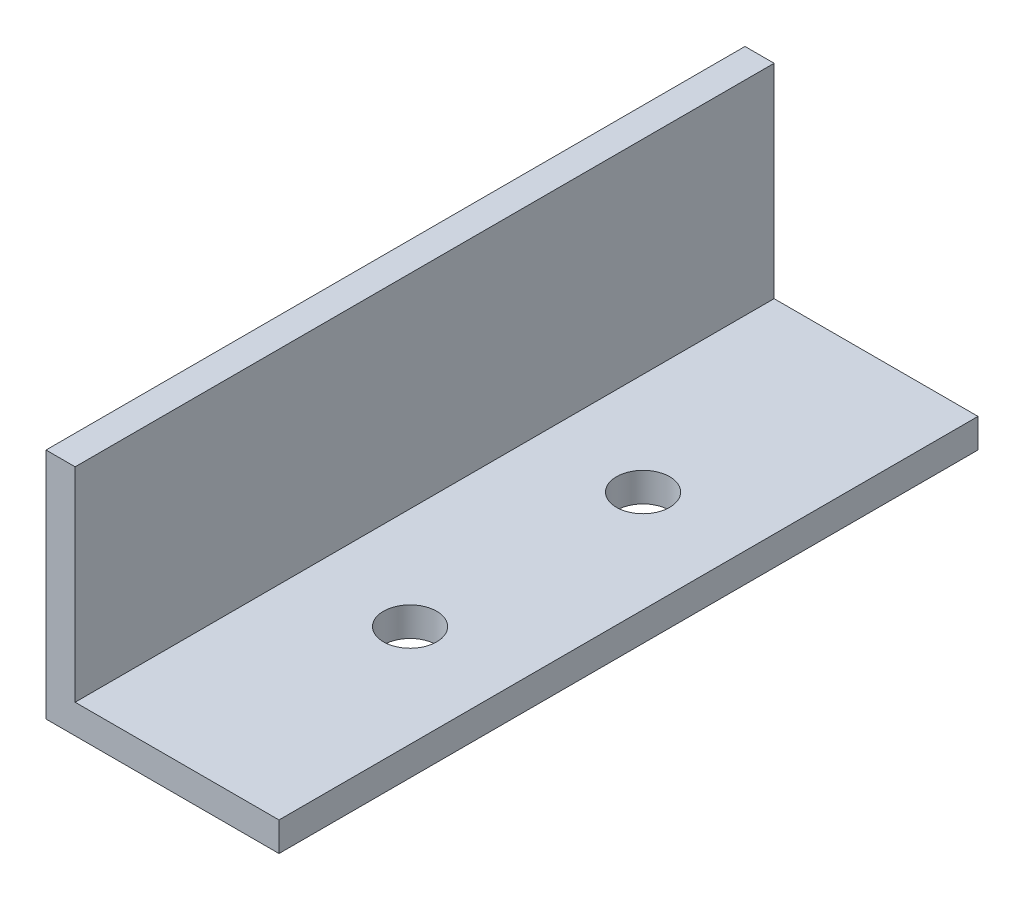
ISO-10303-21;
HEADER;
FILE_DESCRIPTION(('STEP AP214'),'2;1');
FILE_NAME('part.step','',(''),(''),'','','');
FILE_SCHEMA(('AUTOMOTIVE_DESIGN { 1 0 10303 214 1 1 1 1 }'));
ENDSEC;
DATA;
#1=APPLICATION_CONTEXT('core data for automotive mechanical design processes');
#2=APPLICATION_PROTOCOL_DEFINITION('international standard','automotive_design',2000,#1);
#3=PRODUCT_CONTEXT('',#1,'mechanical');
#4=PRODUCT('Part','Part','',(#3));
#5=PRODUCT_RELATED_PRODUCT_CATEGORY('part','',(#4));
#6=PRODUCT_DEFINITION_FORMATION('','',#4);
#7=PRODUCT_DEFINITION_CONTEXT('part definition',#1,'design');
#8=PRODUCT_DEFINITION('design','',#6,#7);
#9=PRODUCT_DEFINITION_SHAPE('','',#8);
#10=(LENGTH_UNIT() NAMED_UNIT(*) SI_UNIT(.MILLI.,.METRE.));
#11=(NAMED_UNIT(*) PLANE_ANGLE_UNIT() SI_UNIT($,.RADIAN.));
#12=(NAMED_UNIT(*) SI_UNIT($,.STERADIAN.) SOLID_ANGLE_UNIT());
#13=UNCERTAINTY_MEASURE_WITH_UNIT(LENGTH_MEASURE(1.E-05),#10,'distance_accuracy_value','');
#14=(GEOMETRIC_REPRESENTATION_CONTEXT(3) GLOBAL_UNCERTAINTY_ASSIGNED_CONTEXT((#13)) GLOBAL_UNIT_ASSIGNED_CONTEXT((#10,
#11,#12)) REPRESENTATION_CONTEXT('',''));
#15=CARTESIAN_POINT('',(0.,0.,0.));
#16=DIRECTION('',(0.,0.,1.));
#17=DIRECTION('',(1.,0.,0.));
#18=AXIS2_PLACEMENT_3D('',#15,#16,#17);
#19=CARTESIAN_POINT('',(0.,0.,76.2));
#20=DIRECTION('',(1.,0.,0.));
#21=DIRECTION('',(0.,0.,-1.));
#22=AXIS2_PLACEMENT_3D('',#19,#20,#21);
#23=PLANE('',#22);
#24=DIRECTION('',(0.,-1.,0.));
#25=VECTOR('',#24,1.);
#26=CARTESIAN_POINT('',(0.,0.,0.));
#27=LINE('',#26,#25);
#28=CARTESIAN_POINT('',(0.,25.4,0.));
#29=VERTEX_POINT('',#28);
#30=CARTESIAN_POINT('',(0.,0.,0.));
#31=VERTEX_POINT('',#30);
#32=EDGE_CURVE('E130',#29,#31,#27,.T.);
#33=ORIENTED_EDGE('',*,*,#32,.T.);
#34=DIRECTION('',(0.,0.,-1.));
#35=VECTOR('',#34,1.);
#36=CARTESIAN_POINT('',(0.,0.,76.2));
#37=LINE('',#36,#35);
#38=CARTESIAN_POINT('',(0.,0.,76.2));
#39=VERTEX_POINT('',#38);
#40=EDGE_CURVE('E11',#39,#31,#37,.T.);
#41=ORIENTED_EDGE('',*,*,#40,.F.);
#42=DIRECTION('',(0.,-1.,0.));
#43=VECTOR('',#42,1.);
#44=CARTESIAN_POINT('',(0.,0.,76.2));
#45=LINE('',#44,#43);
#46=CARTESIAN_POINT('',(0.,25.4,76.2));
#47=VERTEX_POINT('',#46);
#48=EDGE_CURVE('E146',#47,#39,#45,.T.);
#49=ORIENTED_EDGE('',*,*,#48,.F.);
#50=DIRECTION('',(0.,0.,-1.));
#51=VECTOR('',#50,1.);
#52=CARTESIAN_POINT('',(0.,25.4,76.2));
#53=LINE('',#52,#51);
#54=EDGE_CURVE('E126',#47,#29,#53,.T.);
#55=ORIENTED_EDGE('',*,*,#54,.T.);
#56=EDGE_LOOP('',(#33,#41,#49,#55));
#57=FACE_BOUND('',#56,.T.);
#58=ADVANCED_FACE('F39',(#57),#23,.F.);
#59=CARTESIAN_POINT('',(0.,0.,76.2));
#60=DIRECTION('',(0.,1.,0.));
#61=DIRECTION('',(0.,0.,1.));
#62=AXIS2_PLACEMENT_3D('',#59,#60,#61);
#63=PLANE('',#62);
#64=CARTESIAN_POINT('',(14.2875,0.,25.4));
#65=DIRECTION('',(0.,1.,0.));
#66=DIRECTION('',(0.,0.,1.));
#67=AXIS2_PLACEMENT_3D('',#64,#65,#66);
#68=CIRCLE('',#67,2.9);
#69=CARTESIAN_POINT('',(14.2875,0.,22.5));
#70=VERTEX_POINT('',#69);
#71=EDGE_CURVE('E158',#70,#70,#68,.T.);
#72=ORIENTED_EDGE('',*,*,#71,.T.);
#73=EDGE_LOOP('',(#72));
#74=FACE_BOUND('',#73,.T.);
#75=CARTESIAN_POINT('',(14.2875,0.,50.8));
#76=DIRECTION('',(0.,1.,0.));
#77=DIRECTION('',(0.,0.,1.));
#78=AXIS2_PLACEMENT_3D('',#75,#76,#77);
#79=CIRCLE('',#78,2.9);
#80=CARTESIAN_POINT('',(14.2875,0.,47.9));
#81=VERTEX_POINT('',#80);
#82=EDGE_CURVE('E165',#81,#81,#79,.T.);
#83=ORIENTED_EDGE('',*,*,#82,.T.);
#84=EDGE_LOOP('',(#83));
#85=FACE_BOUND('',#84,.T.);
#86=DIRECTION('',(1.,0.,0.));
#87=VECTOR('',#86,1.);
#88=CARTESIAN_POINT('',(0.,0.,0.));
#89=LINE('',#88,#87);
#90=CARTESIAN_POINT('',(25.4,0.,0.));
#91=VERTEX_POINT('',#90);
#92=EDGE_CURVE('E134',#31,#91,#89,.T.);
#93=ORIENTED_EDGE('',*,*,#92,.T.);
#94=DIRECTION('',(0.,0.,-1.));
#95=VECTOR('',#94,1.);
#96=CARTESIAN_POINT('',(25.4,0.,76.2));
#97=LINE('',#96,#95);
#98=CARTESIAN_POINT('',(25.4,0.,76.2));
#99=VERTEX_POINT('',#98);
#100=EDGE_CURVE('E49',#99,#91,#97,.T.);
#101=ORIENTED_EDGE('',*,*,#100,.F.);
#102=DIRECTION('',(1.,0.,0.));
#103=VECTOR('',#102,1.);
#104=CARTESIAN_POINT('',(0.,0.,76.2));
#105=LINE('',#104,#103);
#106=EDGE_CURVE('E95',#39,#99,#105,.T.);
#107=ORIENTED_EDGE('',*,*,#106,.F.);
#108=ORIENTED_EDGE('',*,*,#40,.T.);
#109=EDGE_LOOP('',(#93,#101,#107,#108));
#110=FACE_BOUND('',#109,.T.);
#111=ADVANCED_FACE('F179',(#74,#85,#110),#63,.F.);
#112=CARTESIAN_POINT('',(25.4,0.,76.2));
#113=DIRECTION('',(-1.,0.,0.));
#114=DIRECTION('',(0.,0.,1.));
#115=AXIS2_PLACEMENT_3D('',#112,#113,#114);
#116=PLANE('',#115);
#117=DIRECTION('',(0.,1.,0.));
#118=VECTOR('',#117,1.);
#119=CARTESIAN_POINT('',(25.4,0.,0.));
#120=LINE('',#119,#118);
#121=CARTESIAN_POINT('',(25.4,3.175,0.));
#122=VERTEX_POINT('',#121);
#123=EDGE_CURVE('E137',#91,#122,#120,.T.);
#124=ORIENTED_EDGE('',*,*,#123,.T.);
#125=DIRECTION('',(0.,0.,-1.));
#126=VECTOR('',#125,1.);
#127=CARTESIAN_POINT('',(25.4,3.175,76.2));
#128=LINE('',#127,#126);
#129=CARTESIAN_POINT('',(25.4,3.175,76.2));
#130=VERTEX_POINT('',#129);
#131=EDGE_CURVE('E119',#130,#122,#128,.T.);
#132=ORIENTED_EDGE('',*,*,#131,.F.);
#133=DIRECTION('',(0.,1.,0.));
#134=VECTOR('',#133,1.);
#135=CARTESIAN_POINT('',(25.4,0.,76.2));
#136=LINE('',#135,#134);
#137=EDGE_CURVE('E108',#99,#130,#136,.T.);
#138=ORIENTED_EDGE('',*,*,#137,.F.);
#139=ORIENTED_EDGE('',*,*,#100,.T.);
#140=EDGE_LOOP('',(#124,#132,#138,#139));
#141=FACE_BOUND('',#140,.T.);
#142=ADVANCED_FACE('F182',(#141),#116,.F.);
#143=CARTESIAN_POINT('',(3.175,3.175,76.2));
#144=DIRECTION('',(0.,-1.,0.));
#145=DIRECTION('',(0.,0.,-1.));
#146=AXIS2_PLACEMENT_3D('',#143,#144,#145);
#147=PLANE('',#146);
#148=CARTESIAN_POINT('',(14.2875,3.17500000000001,25.4));
#149=DIRECTION('',(0.,-1.,0.));
#150=DIRECTION('',(0.,0.,-1.));
#151=AXIS2_PLACEMENT_3D('',#148,#149,#150);
#152=CIRCLE('',#151,2.9);
#153=CARTESIAN_POINT('',(14.2875,3.17500000000001,22.5));
#154=VERTEX_POINT('',#153);
#155=EDGE_CURVE('E42',#154,#154,#152,.F.);
#156=ORIENTED_EDGE('',*,*,#155,.F.);
#157=EDGE_LOOP('',(#156));
#158=FACE_BOUND('',#157,.T.);
#159=CARTESIAN_POINT('',(14.2875,3.17500000000001,50.8));
#160=DIRECTION('',(0.,-1.,0.));
#161=DIRECTION('',(0.,0.,-1.));
#162=AXIS2_PLACEMENT_3D('',#159,#160,#161);
#163=CIRCLE('',#162,2.9);
#164=CARTESIAN_POINT('',(14.2875,3.17500000000001,47.9));
#165=VERTEX_POINT('',#164);
#166=EDGE_CURVE('E155',#165,#165,#163,.F.);
#167=ORIENTED_EDGE('',*,*,#166,.F.);
#168=EDGE_LOOP('',(#167));
#169=FACE_BOUND('',#168,.T.);
#170=DIRECTION('',(-1.,0.,0.));
#171=VECTOR('',#170,1.);
#172=CARTESIAN_POINT('',(3.175,3.175,0.));
#173=LINE('',#172,#171);
#174=CARTESIAN_POINT('',(3.175,3.175,0.));
#175=VERTEX_POINT('',#174);
#176=EDGE_CURVE('E117',#122,#175,#173,.T.);
#177=ORIENTED_EDGE('',*,*,#176,.T.);
#178=DIRECTION('',(0.,0.,-1.));
#179=VECTOR('',#178,1.);
#180=CARTESIAN_POINT('',(3.175,3.175,76.2));
#181=LINE('',#180,#179);
#182=CARTESIAN_POINT('',(3.175,3.175,76.2));
#183=VERTEX_POINT('',#182);
#184=EDGE_CURVE('E114',#183,#175,#181,.T.);
#185=ORIENTED_EDGE('',*,*,#184,.F.);
#186=DIRECTION('',(-1.,0.,0.));
#187=VECTOR('',#186,1.);
#188=CARTESIAN_POINT('',(3.175,3.175,76.2));
#189=LINE('',#188,#187);
#190=EDGE_CURVE('E102',#130,#183,#189,.T.);
#191=ORIENTED_EDGE('',*,*,#190,.F.);
#192=ORIENTED_EDGE('',*,*,#131,.T.);
#193=EDGE_LOOP('',(#177,#185,#191,#192));
#194=FACE_BOUND('',#193,.T.);
#195=ADVANCED_FACE('F115',(#158,#169,#194),#147,.F.);
#196=CARTESIAN_POINT('',(3.175,3.175,76.2));
#197=DIRECTION('',(-1.,0.,0.));
#198=DIRECTION('',(0.,0.,1.));
#199=AXIS2_PLACEMENT_3D('',#196,#197,#198);
#200=PLANE('',#199);
#201=DIRECTION('',(0.,1.,0.));
#202=VECTOR('',#201,1.);
#203=CARTESIAN_POINT('',(3.175,3.175,0.));
#204=LINE('',#203,#202);
#205=CARTESIAN_POINT('',(3.175,25.4,0.));
#206=VERTEX_POINT('',#205);
#207=EDGE_CURVE('E81',#175,#206,#204,.T.);
#208=ORIENTED_EDGE('',*,*,#207,.T.);
#209=DIRECTION('',(0.,0.,-1.));
#210=VECTOR('',#209,1.);
#211=CARTESIAN_POINT('',(3.175,25.4,76.2));
#212=LINE('',#211,#210);
#213=CARTESIAN_POINT('',(3.175,25.4,76.2));
#214=VERTEX_POINT('',#213);
#215=EDGE_CURVE('E120',#214,#206,#212,.T.);
#216=ORIENTED_EDGE('',*,*,#215,.F.);
#217=DIRECTION('',(0.,1.,0.));
#218=VECTOR('',#217,1.);
#219=CARTESIAN_POINT('',(3.175,3.175,76.2));
#220=LINE('',#219,#218);
#221=EDGE_CURVE('E106',#183,#214,#220,.T.);
#222=ORIENTED_EDGE('',*,*,#221,.F.);
#223=ORIENTED_EDGE('',*,*,#184,.T.);
#224=EDGE_LOOP('',(#208,#216,#222,#223));
#225=FACE_BOUND('',#224,.T.);
#226=ADVANCED_FACE('F122',(#225),#200,.F.);
#227=CARTESIAN_POINT('',(0.,25.4,76.2));
#228=DIRECTION('',(0.,-1.,0.));
#229=DIRECTION('',(0.,0.,-1.));
#230=AXIS2_PLACEMENT_3D('',#227,#228,#229);
#231=PLANE('',#230);
#232=DIRECTION('',(-1.,0.,0.));
#233=VECTOR('',#232,1.);
#234=CARTESIAN_POINT('',(0.,25.4,0.));
#235=LINE('',#234,#233);
#236=EDGE_CURVE('E87',#206,#29,#235,.T.);
#237=ORIENTED_EDGE('',*,*,#236,.T.);
#238=ORIENTED_EDGE('',*,*,#54,.F.);
#239=DIRECTION('',(-1.,0.,0.));
#240=VECTOR('',#239,1.);
#241=CARTESIAN_POINT('',(0.,25.4,76.2));
#242=LINE('',#241,#240);
#243=EDGE_CURVE('E58',#214,#47,#242,.T.);
#244=ORIENTED_EDGE('',*,*,#243,.F.);
#245=ORIENTED_EDGE('',*,*,#215,.T.);
#246=EDGE_LOOP('',(#237,#238,#244,#245));
#247=FACE_BOUND('',#246,.T.);
#248=ADVANCED_FACE('F187',(#247),#231,.F.);
#249=CARTESIAN_POINT('',(0.,0.,76.2));
#250=DIRECTION('',(0.,0.,-1.));
#251=DIRECTION('',(-1.,0.,0.));
#252=AXIS2_PLACEMENT_3D('',#249,#250,#251);
#253=PLANE('',#252);
#254=ORIENTED_EDGE('',*,*,#48,.T.);
#255=ORIENTED_EDGE('',*,*,#106,.T.);
#256=ORIENTED_EDGE('',*,*,#137,.T.);
#257=ORIENTED_EDGE('',*,*,#190,.T.);
#258=ORIENTED_EDGE('',*,*,#221,.T.);
#259=ORIENTED_EDGE('',*,*,#243,.T.);
#260=EDGE_LOOP('',(#254,#255,#256,#257,#258,#259));
#261=FACE_BOUND('',#260,.T.);
#262=ADVANCED_FACE('F104',(#261),#253,.F.);
#263=CARTESIAN_POINT('',(0.,0.,0.));
#264=DIRECTION('',(0.,0.,-1.));
#265=DIRECTION('',(-1.,0.,0.));
#266=AXIS2_PLACEMENT_3D('',#263,#264,#265);
#267=PLANE('',#266);
#268=ORIENTED_EDGE('',*,*,#32,.F.);
#269=ORIENTED_EDGE('',*,*,#236,.F.);
#270=ORIENTED_EDGE('',*,*,#207,.F.);
#271=ORIENTED_EDGE('',*,*,#176,.F.);
#272=ORIENTED_EDGE('',*,*,#123,.F.);
#273=ORIENTED_EDGE('',*,*,#92,.F.);
#274=EDGE_LOOP('',(#268,#269,#270,#271,#272,#273));
#275=FACE_BOUND('',#274,.T.);
#276=ADVANCED_FACE('F185',(#275),#267,.T.);
#277=CARTESIAN_POINT('',(14.2875,76.2,50.8));
#278=DIRECTION('',(0.,-1.,0.));
#279=DIRECTION('',(0.,0.,-1.));
#280=AXIS2_PLACEMENT_3D('',#277,#278,#279);
#281=CYLINDRICAL_SURFACE('',#280,2.9);
#282=CARTESIAN_POINT('',(14.2875,0.,47.9));
#283=CARTESIAN_POINT('',(14.2875,0.0330729166666682,47.9));
#284=CARTESIAN_POINT('',(14.2875,0.0661458333333365,47.9));
#285=CARTESIAN_POINT('',(14.2875,0.132291666666668,47.9));
#286=CARTESIAN_POINT('',(14.2875,0.165364583333332,47.9));
#287=CARTESIAN_POINT('',(14.2875,0.231510416666664,47.9));
#288=CARTESIAN_POINT('',(14.2875,0.264583333333332,47.9));
#289=CARTESIAN_POINT('',(14.2875,0.330729166666668,47.9));
#290=CARTESIAN_POINT('',(14.2875,0.363802083333337,47.9));
#291=CARTESIAN_POINT('',(14.2875,0.429947916666668,47.9));
#292=CARTESIAN_POINT('',(14.2875,0.463020833333332,47.9));
#293=CARTESIAN_POINT('',(14.2875,0.529166666666664,47.9));
#294=CARTESIAN_POINT('',(14.2875,0.562239583333332,47.9));
#295=CARTESIAN_POINT('',(14.2875,0.628385416666669,47.9));
#296=CARTESIAN_POINT('',(14.2875,0.661458333333337,47.9));
#297=CARTESIAN_POINT('',(14.2875,0.727604166666673,47.9));
#298=CARTESIAN_POINT('',(14.2875,0.760677083333341,47.9));
#299=CARTESIAN_POINT('',(14.2875,0.826822916666673,47.9));
#300=CARTESIAN_POINT('',(14.2875,0.859895833333337,47.9));
#301=CARTESIAN_POINT('',(14.2875,0.926041666666669,47.9));
#302=CARTESIAN_POINT('',(14.2875,0.959114583333337,47.9));
#303=CARTESIAN_POINT('',(14.2875,1.02526041666667,47.9));
#304=CARTESIAN_POINT('',(14.2875,1.05833333333334,47.9));
#305=CARTESIAN_POINT('',(14.2875,1.12447916666667,47.9));
#306=CARTESIAN_POINT('',(14.2875,1.15755208333334,47.9));
#307=CARTESIAN_POINT('',(14.2875,1.22369791666667,47.9));
#308=CARTESIAN_POINT('',(14.2875,1.25677083333334,47.9));
#309=CARTESIAN_POINT('',(14.2875,1.32291666666667,47.9));
#310=CARTESIAN_POINT('',(14.2875,1.35598958333334,47.9));
#311=CARTESIAN_POINT('',(14.2875,1.42213541666667,47.9));
#312=CARTESIAN_POINT('',(14.2875,1.45520833333334,47.9));
#313=CARTESIAN_POINT('',(14.2875,1.52135416666667,47.9));
#314=CARTESIAN_POINT('',(14.2875,1.55442708333334,47.9));
#315=CARTESIAN_POINT('',(14.2875,1.62057291666667,47.9));
#316=CARTESIAN_POINT('',(14.2875,1.65364583333334,47.9));
#317=CARTESIAN_POINT('',(14.2875,1.71979166666667,47.9));
#318=CARTESIAN_POINT('',(14.2875,1.75286458333334,47.9));
#319=CARTESIAN_POINT('',(14.2875,1.81901041666667,47.9));
#320=CARTESIAN_POINT('',(14.2875,1.85208333333334,47.9));
#321=CARTESIAN_POINT('',(14.2875,1.91822916666667,47.9));
#322=CARTESIAN_POINT('',(14.2875,1.95130208333334,47.9));
#323=CARTESIAN_POINT('',(14.2875,2.01744791666667,47.9));
#324=CARTESIAN_POINT('',(14.2875,2.05052083333334,47.9));
#325=CARTESIAN_POINT('',(14.2875,2.11666666666667,47.9));
#326=CARTESIAN_POINT('',(14.2875,2.14973958333334,47.9));
#327=CARTESIAN_POINT('',(14.2875,2.21588541666667,47.9));
#328=CARTESIAN_POINT('',(14.2875,2.24895833333334,47.9));
#329=CARTESIAN_POINT('',(14.2875,2.31510416666667,47.9));
#330=CARTESIAN_POINT('',(14.2875,2.34817708333334,47.9));
#331=CARTESIAN_POINT('',(14.2875,2.41432291666667,47.9));
#332=CARTESIAN_POINT('',(14.2875,2.44739583333334,47.9));
#333=CARTESIAN_POINT('',(14.2875,2.51354166666667,47.9));
#334=CARTESIAN_POINT('',(14.2875,2.54661458333334,47.9));
#335=CARTESIAN_POINT('',(14.2875,2.61276041666668,47.9));
#336=CARTESIAN_POINT('',(14.2875,2.64583333333335,47.9));
#337=CARTESIAN_POINT('',(14.2875,2.71197916666668,47.9));
#338=CARTESIAN_POINT('',(14.2875,2.74505208333334,47.9));
#339=CARTESIAN_POINT('',(14.2875,2.81119791666667,47.9));
#340=CARTESIAN_POINT('',(14.2875,2.84427083333334,47.9));
#341=CARTESIAN_POINT('',(14.2875,2.91041666666668,47.9));
#342=CARTESIAN_POINT('',(14.2875,2.94348958333335,47.9));
#343=CARTESIAN_POINT('',(14.2875,3.00963541666668,47.9));
#344=CARTESIAN_POINT('',(14.2875,3.04270833333334,47.9));
#345=CARTESIAN_POINT('',(14.2875,3.10885416666667,47.9));
#346=CARTESIAN_POINT('',(14.2875,3.14192708333334,47.9));
#347=CARTESIAN_POINT('',(14.2875,3.17500000000001,47.9));
#348=B_SPLINE_CURVE_WITH_KNOTS('',3,(#282,#283,#284,#285,#286,#287,#288,#289,#290,#291,#292,
#293,#294,#295,#296,#297,#298,#299,#300,#301,#302,#303,#304,#305,#306,#307,#308,#309,#310,#311,
#312,#313,#314,#315,#316,#317,#318,#319,#320,#321,#322,#323,#324,#325,#326,#327,#328,#329,#330,
#331,#332,#333,#334,#335,#336,#337,#338,#339,#340,#341,#342,#343,#344,#345,#346,#347),
.UNSPECIFIED.,.F.,.F.,(4,2,2,2,2,2,2,2,2,2,2,2,2,2,2,2,2,2,2,2,2,2,2,2,2,2,2,2,2,2,2,2,4),(0.,
0.0992187500000047,0.198437499999995,0.29765625,0.396875000000005,0.496093749999996,0.5953125,
0.694531250000005,0.79375000000001,0.892968750000001,0.992187500000005,1.09140625000001,
1.190625,1.28984375000001,1.38906250000001,1.48828125,1.58750000000001,1.68671875000001,
1.7859375,1.88515625000001,1.98437500000001,2.08359375,2.18281250000001,2.28203125000001,
2.38125,2.48046875000001,2.57968750000001,2.67890625000002,2.77812500000001,2.87734375000001,
2.97656250000002,3.07578125000001,3.17500000000001),.UNSPECIFIED.);
#349=EDGE_CURVE('BSEAM216',#81,#165,#348,.T.);
#350=ORIENTED_EDGE('',*,*,#82,.F.);
#351=ORIENTED_EDGE('',*,*,#166,.T.);
#352=ORIENTED_EDGE('',*,*,#349,.T.);
#353=ORIENTED_EDGE('',*,*,#349,.F.);
#354=EDGE_LOOP('',(#350,#352,#351,#353));
#355=FACE_BOUND('',#354,.T.);
#356=ADVANCED_FACE('F216',(#355),#281,.F.);
#357=CARTESIAN_POINT('',(14.2875,76.2,25.4));
#358=DIRECTION('',(0.,-1.,0.));
#359=DIRECTION('',(0.,0.,-1.));
#360=AXIS2_PLACEMENT_3D('',#357,#358,#359);
#361=CYLINDRICAL_SURFACE('',#360,2.9);
#362=CARTESIAN_POINT('',(14.2875,0.,22.5));
#363=CARTESIAN_POINT('',(14.2875,0.0330729166666682,22.5));
#364=CARTESIAN_POINT('',(14.2875,0.0661458333333365,22.5));
#365=CARTESIAN_POINT('',(14.2875,0.132291666666668,22.5));
#366=CARTESIAN_POINT('',(14.2875,0.165364583333332,22.5));
#367=CARTESIAN_POINT('',(14.2875,0.231510416666664,22.5));
#368=CARTESIAN_POINT('',(14.2875,0.264583333333332,22.5));
#369=CARTESIAN_POINT('',(14.2875,0.330729166666668,22.5));
#370=CARTESIAN_POINT('',(14.2875,0.363802083333337,22.5));
#371=CARTESIAN_POINT('',(14.2875,0.429947916666668,22.5));
#372=CARTESIAN_POINT('',(14.2875,0.463020833333332,22.5));
#373=CARTESIAN_POINT('',(14.2875,0.529166666666664,22.5));
#374=CARTESIAN_POINT('',(14.2875,0.562239583333332,22.5));
#375=CARTESIAN_POINT('',(14.2875,0.628385416666669,22.5));
#376=CARTESIAN_POINT('',(14.2875,0.661458333333337,22.5));
#377=CARTESIAN_POINT('',(14.2875,0.727604166666673,22.5));
#378=CARTESIAN_POINT('',(14.2875,0.760677083333341,22.5));
#379=CARTESIAN_POINT('',(14.2875,0.826822916666673,22.5));
#380=CARTESIAN_POINT('',(14.2875,0.859895833333337,22.5));
#381=CARTESIAN_POINT('',(14.2875,0.926041666666669,22.5));
#382=CARTESIAN_POINT('',(14.2875,0.959114583333337,22.5));
#383=CARTESIAN_POINT('',(14.2875,1.02526041666667,22.5));
#384=CARTESIAN_POINT('',(14.2875,1.05833333333334,22.5));
#385=CARTESIAN_POINT('',(14.2875,1.12447916666667,22.5));
#386=CARTESIAN_POINT('',(14.2875,1.15755208333334,22.5));
#387=CARTESIAN_POINT('',(14.2875,1.22369791666667,22.5));
#388=CARTESIAN_POINT('',(14.2875,1.25677083333334,22.5));
#389=CARTESIAN_POINT('',(14.2875,1.32291666666667,22.5));
#390=CARTESIAN_POINT('',(14.2875,1.35598958333334,22.5));
#391=CARTESIAN_POINT('',(14.2875,1.42213541666667,22.5));
#392=CARTESIAN_POINT('',(14.2875,1.45520833333334,22.5));
#393=CARTESIAN_POINT('',(14.2875,1.52135416666667,22.5));
#394=CARTESIAN_POINT('',(14.2875,1.55442708333334,22.5));
#395=CARTESIAN_POINT('',(14.2875,1.62057291666667,22.5));
#396=CARTESIAN_POINT('',(14.2875,1.65364583333334,22.5));
#397=CARTESIAN_POINT('',(14.2875,1.71979166666667,22.5));
#398=CARTESIAN_POINT('',(14.2875,1.75286458333334,22.5));
#399=CARTESIAN_POINT('',(14.2875,1.81901041666667,22.5));
#400=CARTESIAN_POINT('',(14.2875,1.85208333333334,22.5));
#401=CARTESIAN_POINT('',(14.2875,1.91822916666667,22.5));
#402=CARTESIAN_POINT('',(14.2875,1.95130208333334,22.5));
#403=CARTESIAN_POINT('',(14.2875,2.01744791666667,22.5));
#404=CARTESIAN_POINT('',(14.2875,2.05052083333334,22.5));
#405=CARTESIAN_POINT('',(14.2875,2.11666666666667,22.5));
#406=CARTESIAN_POINT('',(14.2875,2.14973958333334,22.5));
#407=CARTESIAN_POINT('',(14.2875,2.21588541666667,22.5));
#408=CARTESIAN_POINT('',(14.2875,2.24895833333334,22.5));
#409=CARTESIAN_POINT('',(14.2875,2.31510416666667,22.5));
#410=CARTESIAN_POINT('',(14.2875,2.34817708333334,22.5));
#411=CARTESIAN_POINT('',(14.2875,2.41432291666667,22.5));
#412=CARTESIAN_POINT('',(14.2875,2.44739583333334,22.5));
#413=CARTESIAN_POINT('',(14.2875,2.51354166666667,22.5));
#414=CARTESIAN_POINT('',(14.2875,2.54661458333334,22.5));
#415=CARTESIAN_POINT('',(14.2875,2.61276041666668,22.5));
#416=CARTESIAN_POINT('',(14.2875,2.64583333333335,22.5));
#417=CARTESIAN_POINT('',(14.2875,2.71197916666668,22.5));
#418=CARTESIAN_POINT('',(14.2875,2.74505208333334,22.5));
#419=CARTESIAN_POINT('',(14.2875,2.81119791666667,22.5));
#420=CARTESIAN_POINT('',(14.2875,2.84427083333334,22.5));
#421=CARTESIAN_POINT('',(14.2875,2.91041666666668,22.5));
#422=CARTESIAN_POINT('',(14.2875,2.94348958333335,22.5));
#423=CARTESIAN_POINT('',(14.2875,3.00963541666668,22.5));
#424=CARTESIAN_POINT('',(14.2875,3.04270833333334,22.5));
#425=CARTESIAN_POINT('',(14.2875,3.10885416666667,22.5));
#426=CARTESIAN_POINT('',(14.2875,3.14192708333334,22.5));
#427=CARTESIAN_POINT('',(14.2875,3.17500000000001,22.5));
#428=B_SPLINE_CURVE_WITH_KNOTS('',3,(#362,#363,#364,#365,#366,#367,#368,#369,#370,#371,#372,
#373,#374,#375,#376,#377,#378,#379,#380,#381,#382,#383,#384,#385,#386,#387,#388,#389,#390,#391,
#392,#393,#394,#395,#396,#397,#398,#399,#400,#401,#402,#403,#404,#405,#406,#407,#408,#409,#410,
#411,#412,#413,#414,#415,#416,#417,#418,#419,#420,#421,#422,#423,#424,#425,#426,#427),
.UNSPECIFIED.,.F.,.F.,(4,2,2,2,2,2,2,2,2,2,2,2,2,2,2,2,2,2,2,2,2,2,2,2,2,2,2,2,2,2,2,2,4),(0.,
0.0992187500000047,0.198437499999995,0.29765625,0.396875000000005,0.496093749999996,0.5953125,
0.694531250000005,0.79375000000001,0.892968750000001,0.992187500000005,1.09140625000001,
1.190625,1.28984375000001,1.38906250000001,1.48828125,1.58750000000001,1.68671875000001,
1.7859375,1.88515625000001,1.98437500000001,2.08359375,2.18281250000001,2.28203125000001,
2.38125,2.48046875000001,2.57968750000001,2.67890625000002,2.77812500000001,2.87734375000001,
2.97656250000002,3.07578125000001,3.17500000000001),.UNSPECIFIED.);
#429=EDGE_CURVE('BSEAM214',#70,#154,#428,.T.);
#430=ORIENTED_EDGE('',*,*,#71,.F.);
#431=ORIENTED_EDGE('',*,*,#155,.T.);
#432=ORIENTED_EDGE('',*,*,#429,.T.);
#433=ORIENTED_EDGE('',*,*,#429,.F.);
#434=EDGE_LOOP('',(#430,#432,#431,#433));
#435=FACE_BOUND('',#434,.T.);
#436=ADVANCED_FACE('F214',(#435),#361,.F.);
#437=CLOSED_SHELL('',(#58,#111,#142,#195,#226,#248,#262,#276,#356,#436));
#438=MANIFOLD_SOLID_BREP('B2',#437);
#439=ADVANCED_BREP_SHAPE_REPRESENTATION('',(#18,#438),#14);
#440=SHAPE_DEFINITION_REPRESENTATION(#9,#439);
ENDSEC;
END-ISO-10303-21;
